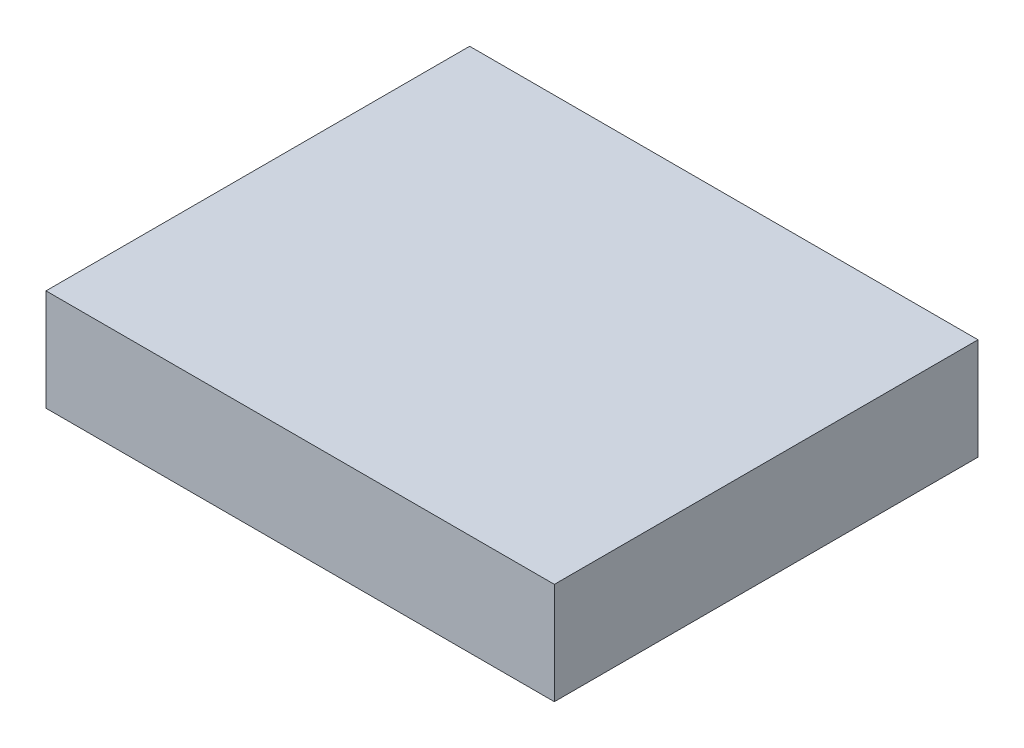
ISO-10303-21;
HEADER;
FILE_DESCRIPTION(('STEP AP214'),'2;1');
FILE_NAME('part.step','',(''),(''),'','','');
FILE_SCHEMA(('AUTOMOTIVE_DESIGN { 1 0 10303 214 1 1 1 1 }'));
ENDSEC;
DATA;
#1=APPLICATION_CONTEXT('core data for automotive mechanical design processes');
#2=APPLICATION_PROTOCOL_DEFINITION('international standard','automotive_design',2000,#1);
#3=PRODUCT_CONTEXT('',#1,'mechanical');
#4=PRODUCT('Part','Part','',(#3));
#5=PRODUCT_RELATED_PRODUCT_CATEGORY('part','',(#4));
#6=PRODUCT_DEFINITION_FORMATION('','',#4);
#7=PRODUCT_DEFINITION_CONTEXT('part definition',#1,'design');
#8=PRODUCT_DEFINITION('design','',#6,#7);
#9=PRODUCT_DEFINITION_SHAPE('','',#8);
#10=(LENGTH_UNIT() NAMED_UNIT(*) SI_UNIT(.MILLI.,.METRE.));
#11=(NAMED_UNIT(*) PLANE_ANGLE_UNIT() SI_UNIT($,.RADIAN.));
#12=(NAMED_UNIT(*) SI_UNIT($,.STERADIAN.) SOLID_ANGLE_UNIT());
#13=UNCERTAINTY_MEASURE_WITH_UNIT(LENGTH_MEASURE(1.E-05),#10,'distance_accuracy_value','');
#14=(GEOMETRIC_REPRESENTATION_CONTEXT(3) GLOBAL_UNCERTAINTY_ASSIGNED_CONTEXT((#13)) GLOBAL_UNIT_ASSIGNED_CONTEXT((#10,
#11,#12)) REPRESENTATION_CONTEXT('',''));
#15=CARTESIAN_POINT('',(0.,0.,0.));
#16=DIRECTION('',(0.,0.,1.));
#17=DIRECTION('',(1.,0.,0.));
#18=AXIS2_PLACEMENT_3D('',#15,#16,#17);
#19=CARTESIAN_POINT('',(320.,1254.,-600.));
#20=DIRECTION('',(-1.,0.,0.));
#21=DIRECTION('',(0.,0.,1.));
#22=AXIS2_PLACEMENT_3D('',#19,#20,#21);
#23=PLANE('',#22);
#24=DIRECTION('',(0.,-1.,0.));
#25=VECTOR('',#24,1.);
#26=CARTESIAN_POINT('',(320.,1254.,-550.));
#27=LINE('',#26,#25);
#28=CARTESIAN_POINT('',(320.,1266.,-550.));
#29=VERTEX_POINT('',#28);
#30=CARTESIAN_POINT('',(320.,1254.,-550.));
#31=VERTEX_POINT('',#30);
#32=EDGE_CURVE('E103',#29,#31,#27,.T.);
#33=ORIENTED_EDGE('',*,*,#32,.F.);
#34=DIRECTION('',(0.,0.,1.));
#35=VECTOR('',#34,1.);
#36=CARTESIAN_POINT('',(320.,1266.,-600.));
#37=LINE('',#36,#35);
#38=CARTESIAN_POINT('',(320.,1266.,-600.));
#39=VERTEX_POINT('',#38);
#40=EDGE_CURVE('E11',#39,#29,#37,.T.);
#41=ORIENTED_EDGE('',*,*,#40,.F.);
#42=DIRECTION('',(0.,-1.,0.));
#43=VECTOR('',#42,1.);
#44=CARTESIAN_POINT('',(320.,1254.,-600.));
#45=LINE('',#44,#43);
#46=CARTESIAN_POINT('',(320.,1254.,-600.));
#47=VERTEX_POINT('',#46);
#48=EDGE_CURVE('E97',#39,#47,#45,.T.);
#49=ORIENTED_EDGE('',*,*,#48,.T.);
#50=DIRECTION('',(0.,0.,1.));
#51=VECTOR('',#50,1.);
#52=CARTESIAN_POINT('',(320.,1254.,-600.));
#53=LINE('',#52,#51);
#54=EDGE_CURVE('E42',#47,#31,#53,.T.);
#55=ORIENTED_EDGE('',*,*,#54,.T.);
#56=EDGE_LOOP('',(#33,#41,#49,#55));
#57=FACE_BOUND('',#56,.T.);
#58=ADVANCED_FACE('F39',(#57),#23,.T.);
#59=CARTESIAN_POINT('',(320.,1266.,-600.));
#60=DIRECTION('',(0.,1.,0.));
#61=DIRECTION('',(0.,0.,1.));
#62=AXIS2_PLACEMENT_3D('',#59,#60,#61);
#63=PLANE('',#62);
#64=DIRECTION('',(-1.,0.,0.));
#65=VECTOR('',#64,1.);
#66=CARTESIAN_POINT('',(320.,1266.,-550.));
#67=LINE('',#66,#65);
#68=CARTESIAN_POINT('',(380.,1266.,-550.));
#69=VERTEX_POINT('',#68);
#70=EDGE_CURVE('E99',#69,#29,#67,.T.);
#71=ORIENTED_EDGE('',*,*,#70,.F.);
#72=DIRECTION('',(0.,0.,1.));
#73=VECTOR('',#72,1.);
#74=CARTESIAN_POINT('',(380.,1266.,-600.));
#75=LINE('',#74,#73);
#76=CARTESIAN_POINT('',(380.,1266.,-600.));
#77=VERTEX_POINT('',#76);
#78=EDGE_CURVE('E48',#77,#69,#75,.T.);
#79=ORIENTED_EDGE('',*,*,#78,.F.);
#80=DIRECTION('',(-1.,0.,0.));
#81=VECTOR('',#80,1.);
#82=CARTESIAN_POINT('',(320.,1266.,-600.));
#83=LINE('',#82,#81);
#84=EDGE_CURVE('E94',#77,#39,#83,.T.);
#85=ORIENTED_EDGE('',*,*,#84,.T.);
#86=ORIENTED_EDGE('',*,*,#40,.T.);
#87=EDGE_LOOP('',(#71,#79,#85,#86));
#88=FACE_BOUND('',#87,.T.);
#89=ADVANCED_FACE('F113',(#88),#63,.T.);
#90=CARTESIAN_POINT('',(380.,1254.,-600.));
#91=DIRECTION('',(1.,0.,0.));
#92=DIRECTION('',(0.,0.,-1.));
#93=AXIS2_PLACEMENT_3D('',#90,#91,#92);
#94=PLANE('',#93);
#95=DIRECTION('',(0.,1.,0.));
#96=VECTOR('',#95,1.);
#97=CARTESIAN_POINT('',(380.,1254.,-550.));
#98=LINE('',#97,#96);
#99=CARTESIAN_POINT('',(380.,1254.,-550.));
#100=VERTEX_POINT('',#99);
#101=EDGE_CURVE('E89',#100,#69,#98,.T.);
#102=ORIENTED_EDGE('',*,*,#101,.F.);
#103=DIRECTION('',(0.,0.,1.));
#104=VECTOR('',#103,1.);
#105=CARTESIAN_POINT('',(380.,1254.,-600.));
#106=LINE('',#105,#104);
#107=CARTESIAN_POINT('',(380.,1254.,-600.));
#108=VERTEX_POINT('',#107);
#109=EDGE_CURVE('E84',#108,#100,#106,.T.);
#110=ORIENTED_EDGE('',*,*,#109,.F.);
#111=DIRECTION('',(0.,1.,0.));
#112=VECTOR('',#111,1.);
#113=CARTESIAN_POINT('',(380.,1254.,-600.));
#114=LINE('',#113,#112);
#115=EDGE_CURVE('E87',#108,#77,#114,.T.);
#116=ORIENTED_EDGE('',*,*,#115,.T.);
#117=ORIENTED_EDGE('',*,*,#78,.T.);
#118=EDGE_LOOP('',(#102,#110,#116,#117));
#119=FACE_BOUND('',#118,.T.);
#120=ADVANCED_FACE('F86',(#119),#94,.T.);
#121=CARTESIAN_POINT('',(320.,1254.,-600.));
#122=DIRECTION('',(0.,-1.,0.));
#123=DIRECTION('',(0.,0.,-1.));
#124=AXIS2_PLACEMENT_3D('',#121,#122,#123);
#125=PLANE('',#124);
#126=DIRECTION('',(1.,0.,0.));
#127=VECTOR('',#126,1.);
#128=CARTESIAN_POINT('',(320.,1254.,-550.));
#129=LINE('',#128,#127);
#130=EDGE_CURVE('E106',#31,#100,#129,.T.);
#131=ORIENTED_EDGE('',*,*,#130,.F.);
#132=ORIENTED_EDGE('',*,*,#54,.F.);
#133=DIRECTION('',(1.,0.,0.));
#134=VECTOR('',#133,1.);
#135=CARTESIAN_POINT('',(320.,1254.,-600.));
#136=LINE('',#135,#134);
#137=EDGE_CURVE('E93',#47,#108,#136,.T.);
#138=ORIENTED_EDGE('',*,*,#137,.T.);
#139=ORIENTED_EDGE('',*,*,#109,.T.);
#140=EDGE_LOOP('',(#131,#132,#138,#139));
#141=FACE_BOUND('',#140,.T.);
#142=ADVANCED_FACE('F96',(#141),#125,.T.);
#143=CARTESIAN_POINT('',(0.,0.,-600.));
#144=DIRECTION('',(0.,0.,-1.));
#145=DIRECTION('',(-1.,0.,0.));
#146=AXIS2_PLACEMENT_3D('',#143,#144,#145);
#147=PLANE('',#146);
#148=ORIENTED_EDGE('',*,*,#48,.F.);
#149=ORIENTED_EDGE('',*,*,#84,.F.);
#150=ORIENTED_EDGE('',*,*,#115,.F.);
#151=ORIENTED_EDGE('',*,*,#137,.F.);
#152=EDGE_LOOP('',(#148,#149,#150,#151));
#153=FACE_BOUND('',#152,.T.);
#154=ADVANCED_FACE('F92',(#153),#147,.T.);
#155=CARTESIAN_POINT('',(0.,0.,-550.));
#156=DIRECTION('',(0.,0.,-1.));
#157=DIRECTION('',(-1.,0.,0.));
#158=AXIS2_PLACEMENT_3D('',#155,#156,#157);
#159=PLANE('',#158);
#160=ORIENTED_EDGE('',*,*,#32,.T.);
#161=ORIENTED_EDGE('',*,*,#130,.T.);
#162=ORIENTED_EDGE('',*,*,#101,.T.);
#163=ORIENTED_EDGE('',*,*,#70,.T.);
#164=EDGE_LOOP('',(#160,#161,#162,#163));
#165=FACE_BOUND('',#164,.T.);
#166=ADVANCED_FACE('F112',(#165),#159,.F.);
#167=CLOSED_SHELL('',(#58,#89,#120,#142,#154,#166));
#168=MANIFOLD_SOLID_BREP('B2',#167);
#169=ADVANCED_BREP_SHAPE_REPRESENTATION('',(#18,#168),#14);
#170=SHAPE_DEFINITION_REPRESENTATION(#9,#169);
ENDSEC;
END-ISO-10303-21;
